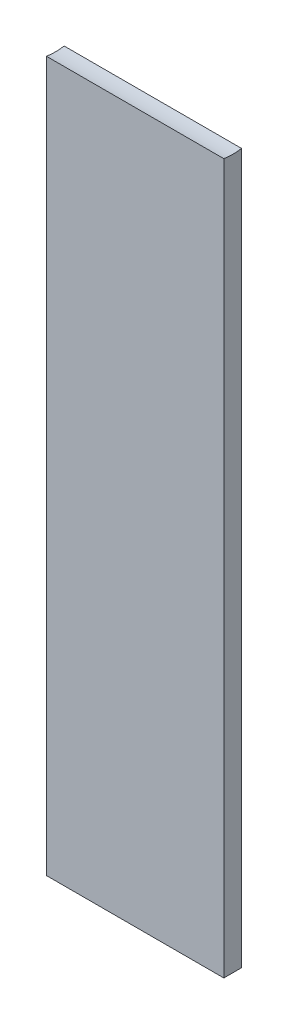
ISO-10303-21;
HEADER;
FILE_DESCRIPTION(('STEP AP214'),'2;1');
FILE_NAME('part.step','',(''),(''),'','','');
FILE_SCHEMA(('AUTOMOTIVE_DESIGN { 1 0 10303 214 1 1 1 1 }'));
ENDSEC;
DATA;
#1=APPLICATION_CONTEXT('core data for automotive mechanical design processes');
#2=APPLICATION_PROTOCOL_DEFINITION('international standard','automotive_design',2000,#1);
#3=PRODUCT_CONTEXT('',#1,'mechanical');
#4=PRODUCT('Part','Part','',(#3));
#5=PRODUCT_RELATED_PRODUCT_CATEGORY('part','',(#4));
#6=PRODUCT_DEFINITION_FORMATION('','',#4);
#7=PRODUCT_DEFINITION_CONTEXT('part definition',#1,'design');
#8=PRODUCT_DEFINITION('design','',#6,#7);
#9=PRODUCT_DEFINITION_SHAPE('','',#8);
#10=(LENGTH_UNIT() NAMED_UNIT(*) SI_UNIT(.MILLI.,.METRE.));
#11=(NAMED_UNIT(*) PLANE_ANGLE_UNIT() SI_UNIT($,.RADIAN.));
#12=(NAMED_UNIT(*) SI_UNIT($,.STERADIAN.) SOLID_ANGLE_UNIT());
#13=UNCERTAINTY_MEASURE_WITH_UNIT(LENGTH_MEASURE(1.E-05),#10,'distance_accuracy_value','');
#14=(GEOMETRIC_REPRESENTATION_CONTEXT(3) GLOBAL_UNCERTAINTY_ASSIGNED_CONTEXT((#13)) GLOBAL_UNIT_ASSIGNED_CONTEXT((#10,
#11,#12)) REPRESENTATION_CONTEXT('',''));
#15=CARTESIAN_POINT('',(0.,0.,0.));
#16=DIRECTION('',(0.,0.,1.));
#17=DIRECTION('',(1.,0.,0.));
#18=AXIS2_PLACEMENT_3D('',#15,#16,#17);
#19=CARTESIAN_POINT('',(-6.34999999999999,50.8,0.635000000000003));
#20=DIRECTION('',(1.,0.,0.));
#21=DIRECTION('',(0.,0.,-1.));
#22=AXIS2_PLACEMENT_3D('',#19,#20,#21);
#23=PLANE('',#22);
#24=DIRECTION('',(0.,-1.,0.));
#25=VECTOR('',#24,1.);
#26=CARTESIAN_POINT('',(-6.34999999999999,50.8,0.635000000000003));
#27=LINE('',#26,#25);
#28=CARTESIAN_POINT('',(-6.34999999999999,50.8,0.635000000000003));
#29=VERTEX_POINT('',#28);
#30=CARTESIAN_POINT('',(-6.34999999999999,0.,0.635000000000003));
#31=VERTEX_POINT('',#30);
#32=EDGE_CURVE('E11',#29,#31,#27,.T.);
#33=ORIENTED_EDGE('',*,*,#32,.F.);
#34=CARTESIAN_POINT('',(-6.34999999999999,54.5567106622683,0.));
#35=DIRECTION('',(1.,0.,0.));
#36=DIRECTION('',(0.,0.,-1.));
#37=AXIS2_PLACEMENT_3D('',#34,#35,#36);
#38=CIRCLE('',#37,3.81);
#39=CARTESIAN_POINT('',(-6.34999999999999,50.8,-0.634999999999987));
#40=VERTEX_POINT('',#39);
#41=EDGE_CURVE('E99',#29,#40,#38,.T.);
#42=ORIENTED_EDGE('',*,*,#41,.T.);
#43=DIRECTION('',(0.,-1.,0.));
#44=VECTOR('',#43,1.);
#45=CARTESIAN_POINT('',(-6.34999999999999,50.8,-0.635));
#46=LINE('',#45,#44);
#47=CARTESIAN_POINT('',(-6.34999999999999,0.,-0.635));
#48=VERTEX_POINT('',#47);
#49=EDGE_CURVE('E81',#40,#48,#46,.T.);
#50=ORIENTED_EDGE('',*,*,#49,.T.);
#51=DIRECTION('',(0.,0.,1.));
#52=VECTOR('',#51,1.);
#53=CARTESIAN_POINT('',(-6.34999999999999,0.,0.635000000000003));
#54=LINE('',#53,#52);
#55=EDGE_CURVE('E86',#48,#31,#54,.T.);
#56=ORIENTED_EDGE('',*,*,#55,.T.);
#57=EDGE_LOOP('',(#33,#42,#50,#56));
#58=FACE_BOUND('',#57,.T.);
#59=ADVANCED_FACE('F33',(#58),#23,.F.);
#60=CARTESIAN_POINT('',(6.35000000000001,50.8,0.634999999999999));
#61=DIRECTION('',(0.,0.,-1.));
#62=DIRECTION('',(-1.,0.,0.));
#63=AXIS2_PLACEMENT_3D('',#60,#61,#62);
#64=PLANE('',#63);
#65=DIRECTION('',(1.,0.,0.));
#66=VECTOR('',#65,1.);
#67=CARTESIAN_POINT('',(6.35000000000001,0.,0.634999999999999));
#68=LINE('',#67,#66);
#69=CARTESIAN_POINT('',(6.35000000000001,0.,0.634999999999999));
#70=VERTEX_POINT('',#69);
#71=EDGE_CURVE('E74',#31,#70,#68,.T.);
#72=ORIENTED_EDGE('',*,*,#71,.T.);
#73=DIRECTION('',(0.,-1.,0.));
#74=VECTOR('',#73,1.);
#75=CARTESIAN_POINT('',(6.35000000000001,50.8,0.634999999999999));
#76=LINE('',#75,#74);
#77=CARTESIAN_POINT('',(6.35000000000001,50.8,0.634999999999986));
#78=VERTEX_POINT('',#77);
#79=EDGE_CURVE('E41',#78,#70,#76,.T.);
#80=ORIENTED_EDGE('',*,*,#79,.F.);
#81=DIRECTION('',(1.,0.,0.));
#82=VECTOR('',#81,1.);
#83=CARTESIAN_POINT('',(6.35000000000001,50.8,0.634999999999999));
#84=LINE('',#83,#82);
#85=EDGE_CURVE('E87',#29,#78,#84,.T.);
#86=ORIENTED_EDGE('',*,*,#85,.F.);
#87=ORIENTED_EDGE('',*,*,#32,.T.);
#88=EDGE_LOOP('',(#72,#80,#86,#87));
#89=FACE_BOUND('',#88,.T.);
#90=ADVANCED_FACE('F101',(#89),#64,.F.);
#91=CARTESIAN_POINT('',(6.35000000000001,50.8,0.634999999999999));
#92=DIRECTION('',(-1.,0.,0.));
#93=DIRECTION('',(0.,0.,1.));
#94=AXIS2_PLACEMENT_3D('',#91,#92,#93);
#95=PLANE('',#94);
#96=DIRECTION('',(0.,-1.,0.));
#97=VECTOR('',#96,1.);
#98=CARTESIAN_POINT('',(6.35000000000001,50.8,-0.635000000000001));
#99=LINE('',#98,#97);
#100=CARTESIAN_POINT('',(6.35000000000001,50.8,-0.635000000000001));
#101=VERTEX_POINT('',#100);
#102=CARTESIAN_POINT('',(6.35000000000001,0.,-0.635000000000001));
#103=VERTEX_POINT('',#102);
#104=EDGE_CURVE('E68',#101,#103,#99,.T.);
#105=ORIENTED_EDGE('',*,*,#104,.F.);
#106=CARTESIAN_POINT('',(6.35000000000001,54.5567106622683,0.));
#107=DIRECTION('',(1.,0.,0.));
#108=DIRECTION('',(0.,0.,-1.));
#109=AXIS2_PLACEMENT_3D('',#106,#107,#108);
#110=CIRCLE('',#109,3.81);
#111=EDGE_CURVE('E48',#78,#101,#110,.T.);
#112=ORIENTED_EDGE('',*,*,#111,.F.);
#113=ORIENTED_EDGE('',*,*,#79,.T.);
#114=DIRECTION('',(0.,0.,-1.));
#115=VECTOR('',#114,1.);
#116=CARTESIAN_POINT('',(6.35000000000001,0.,0.634999999999999));
#117=LINE('',#116,#115);
#118=EDGE_CURVE('E65',#70,#103,#117,.T.);
#119=ORIENTED_EDGE('',*,*,#118,.T.);
#120=EDGE_LOOP('',(#105,#112,#113,#119));
#121=FACE_BOUND('',#120,.T.);
#122=ADVANCED_FACE('F67',(#121),#95,.F.);
#123=CARTESIAN_POINT('',(6.35000000000001,50.8,-0.635000000000001));
#124=DIRECTION('',(0.,0.,1.));
#125=DIRECTION('',(1.,0.,0.));
#126=AXIS2_PLACEMENT_3D('',#123,#124,#125);
#127=PLANE('',#126);
#128=DIRECTION('',(-1.,0.,0.));
#129=VECTOR('',#128,1.);
#130=CARTESIAN_POINT('',(6.35000000000001,0.,-0.635000000000001));
#131=LINE('',#130,#129);
#132=EDGE_CURVE('E73',#103,#48,#131,.T.);
#133=ORIENTED_EDGE('',*,*,#132,.T.);
#134=ORIENTED_EDGE('',*,*,#49,.F.);
#135=DIRECTION('',(-1.,0.,0.));
#136=VECTOR('',#135,1.);
#137=CARTESIAN_POINT('',(6.35000000000001,50.8,-0.635000000000001));
#138=LINE('',#137,#136);
#139=EDGE_CURVE('E80',#101,#40,#138,.T.);
#140=ORIENTED_EDGE('',*,*,#139,.F.);
#141=ORIENTED_EDGE('',*,*,#104,.T.);
#142=EDGE_LOOP('',(#133,#134,#140,#141));
#143=FACE_BOUND('',#142,.T.);
#144=ADVANCED_FACE('F77',(#143),#127,.F.);
#145=CARTESIAN_POINT('',(0.,0.,0.));
#146=DIRECTION('',(0.,1.,0.));
#147=DIRECTION('',(0.,0.,1.));
#148=AXIS2_PLACEMENT_3D('',#145,#146,#147);
#149=PLANE('',#148);
#150=ORIENTED_EDGE('',*,*,#55,.F.);
#151=ORIENTED_EDGE('',*,*,#132,.F.);
#152=ORIENTED_EDGE('',*,*,#118,.F.);
#153=ORIENTED_EDGE('',*,*,#71,.F.);
#154=EDGE_LOOP('',(#150,#151,#152,#153));
#155=FACE_BOUND('',#154,.T.);
#156=ADVANCED_FACE('F84',(#155),#149,.F.);
#157=CARTESIAN_POINT('',(-44.45,54.5567106622683,0.));
#158=DIRECTION('',(1.,0.,0.));
#159=DIRECTION('',(0.,0.,-1.));
#160=AXIS2_PLACEMENT_3D('',#157,#158,#159);
#161=CYLINDRICAL_SURFACE('',#160,3.81);
#162=ORIENTED_EDGE('',*,*,#85,.T.);
#163=ORIENTED_EDGE('',*,*,#111,.T.);
#164=ORIENTED_EDGE('',*,*,#139,.T.);
#165=ORIENTED_EDGE('',*,*,#41,.F.);
#166=EDGE_LOOP('',(#162,#163,#164,#165));
#167=FACE_BOUND('',#166,.T.);
#168=ADVANCED_FACE('F118',(#167),#161,.F.);
#169=CLOSED_SHELL('',(#59,#90,#122,#144,#156,#168));
#170=MANIFOLD_SOLID_BREP('B2',#169);
#171=ADVANCED_BREP_SHAPE_REPRESENTATION('',(#18,#170),#14);
#172=SHAPE_DEFINITION_REPRESENTATION(#9,#171);
ENDSEC;
END-ISO-10303-21;
